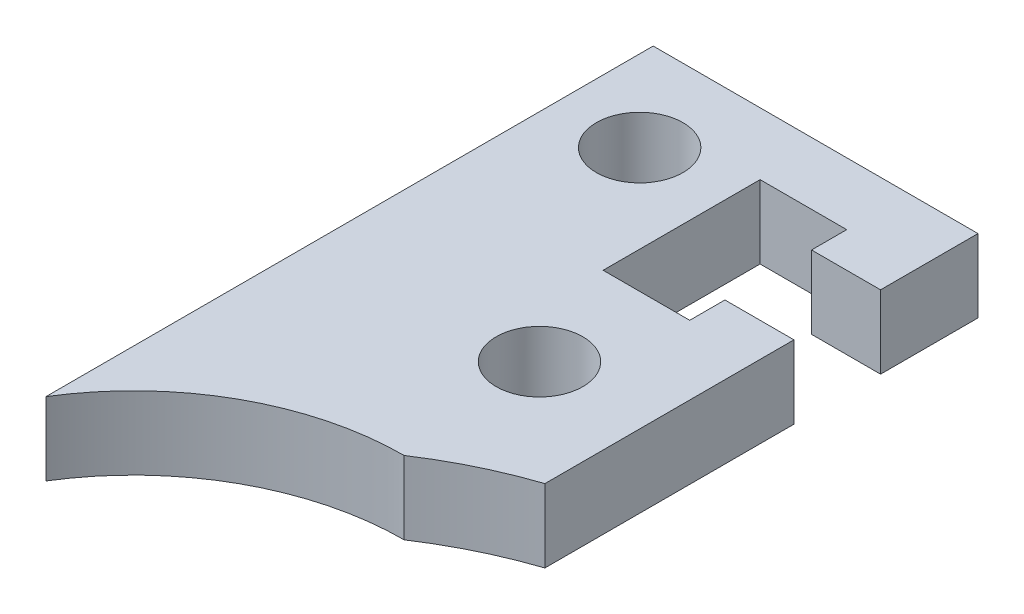
ISO-10303-21;
HEADER;
FILE_DESCRIPTION(('STEP AP214'),'2;1');
FILE_NAME('part.step','',(''),(''),'','','');
FILE_SCHEMA(('AUTOMOTIVE_DESIGN { 1 0 10303 214 1 1 1 1 }'));
ENDSEC;
DATA;
#1=APPLICATION_CONTEXT('core data for automotive mechanical design processes');
#2=APPLICATION_PROTOCOL_DEFINITION('international standard','automotive_design',2000,#1);
#3=PRODUCT_CONTEXT('',#1,'mechanical');
#4=PRODUCT('Part','Part','',(#3));
#5=PRODUCT_RELATED_PRODUCT_CATEGORY('part','',(#4));
#6=PRODUCT_DEFINITION_FORMATION('','',#4);
#7=PRODUCT_DEFINITION_CONTEXT('part definition',#1,'design');
#8=PRODUCT_DEFINITION('design','',#6,#7);
#9=PRODUCT_DEFINITION_SHAPE('','',#8);
#10=(LENGTH_UNIT() NAMED_UNIT(*) SI_UNIT(.MILLI.,.METRE.));
#11=(NAMED_UNIT(*) PLANE_ANGLE_UNIT() SI_UNIT($,.RADIAN.));
#12=(NAMED_UNIT(*) SI_UNIT($,.STERADIAN.) SOLID_ANGLE_UNIT());
#13=UNCERTAINTY_MEASURE_WITH_UNIT(LENGTH_MEASURE(1.E-05),#10,'distance_accuracy_value','');
#14=(GEOMETRIC_REPRESENTATION_CONTEXT(3) GLOBAL_UNCERTAINTY_ASSIGNED_CONTEXT((#13)) GLOBAL_UNIT_ASSIGNED_CONTEXT((#10,
#11,#12)) REPRESENTATION_CONTEXT('',''));
#15=CARTESIAN_POINT('',(0.,0.,0.));
#16=DIRECTION('',(0.,0.,1.));
#17=DIRECTION('',(1.,0.,0.));
#18=AXIS2_PLACEMENT_3D('',#15,#16,#17);
#19=CARTESIAN_POINT('',(0.,-1.35,0.));
#20=DIRECTION('',(0.,1.,0.));
#21=DIRECTION('',(1.,0.,0.));
#22=AXIS2_PLACEMENT_3D('',#19,#20,#21);
#23=PLANE('',#22);
#24=DIRECTION('',(0.,0.,1.));
#25=VECTOR('',#24,1.);
#26=CARTESIAN_POINT('',(19.5,-1.35,-20.9));
#27=LINE('',#26,#25);
#28=CARTESIAN_POINT('',(19.5,-1.35,-20.9));
#29=VERTEX_POINT('',#28);
#30=CARTESIAN_POINT('',(19.5,-1.35,-11.7));
#31=VERTEX_POINT('',#30);
#32=EDGE_CURVE('E11',#29,#31,#27,.T.);
#33=ORIENTED_EDGE('',*,*,#32,.T.);
#34=CARTESIAN_POINT('',(24.24820293215,-1.35,2.528653095606));
#35=DIRECTION('',(0.,1.,0.));
#36=DIRECTION('',(-0.31654686214341,0.,-0.94857687304043));
#37=AXIS2_PLACEMENT_3D('',#34,#35,#36);
#38=CIRCLE('',#37,15.);
#39=CARTESIAN_POINT('',(16.,-1.35,-10.));
#40=VERTEX_POINT('',#39);
#41=EDGE_CURVE('E27',#31,#40,#38,.T.);
#42=ORIENTED_EDGE('',*,*,#41,.T.);
#43=CARTESIAN_POINT('',(16.,-1.35,0.));
#44=DIRECTION('',(0.,1.,0.));
#45=DIRECTION('',(0.,0.,-1.));
#46=AXIS2_PLACEMENT_3D('',#43,#44,#45);
#47=CIRCLE('',#46,10.);
#48=CARTESIAN_POINT('',(7.5,-1.35,-5.267826876426));
#49=VERTEX_POINT('',#48);
#50=EDGE_CURVE('E244',#40,#49,#47,.T.);
#51=ORIENTED_EDGE('',*,*,#50,.T.);
#52=DIRECTION('',(0.,0.,-1.));
#53=VECTOR('',#52,1.);
#54=CARTESIAN_POINT('',(7.5,-1.35,-5.267826876426));
#55=LINE('',#54,#53);
#56=CARTESIAN_POINT('',(7.5,-1.35,-27.7));
#57=VERTEX_POINT('',#56);
#58=EDGE_CURVE('E240',#49,#57,#55,.T.);
#59=ORIENTED_EDGE('',*,*,#58,.T.);
#60=DIRECTION('',(-1.,0.,0.));
#61=VECTOR('',#60,1.);
#62=CARTESIAN_POINT('',(19.5,-1.35,-27.7));
#63=LINE('',#62,#61);
#64=CARTESIAN_POINT('',(19.5,-1.35,-27.7));
#65=VERTEX_POINT('',#64);
#66=EDGE_CURVE('E155',#65,#57,#63,.T.);
#67=ORIENTED_EDGE('',*,*,#66,.F.);
#68=DIRECTION('',(0.,0.,1.));
#69=VECTOR('',#68,1.);
#70=CARTESIAN_POINT('',(19.5,-1.35,-27.7));
#71=LINE('',#70,#69);
#72=CARTESIAN_POINT('',(19.5,-1.35,-24.1));
#73=VERTEX_POINT('',#72);
#74=EDGE_CURVE('E237',#65,#73,#71,.T.);
#75=ORIENTED_EDGE('',*,*,#74,.T.);
#76=DIRECTION('',(-1.,0.,0.));
#77=VECTOR('',#76,1.);
#78=CARTESIAN_POINT('',(19.5,-1.35,-24.1));
#79=LINE('',#78,#77);
#80=CARTESIAN_POINT('',(16.95,-1.35,-24.1));
#81=VERTEX_POINT('',#80);
#82=EDGE_CURVE('E234',#73,#81,#79,.T.);
#83=ORIENTED_EDGE('',*,*,#82,.T.);
#84=DIRECTION('',(0.,0.,-1.));
#85=VECTOR('',#84,1.);
#86=CARTESIAN_POINT('',(16.95,-1.35,-24.1));
#87=LINE('',#86,#85);
#88=CARTESIAN_POINT('',(16.95,-1.35,-25.4));
#89=VERTEX_POINT('',#88);
#90=EDGE_CURVE('E231',#81,#89,#87,.T.);
#91=ORIENTED_EDGE('',*,*,#90,.T.);
#92=DIRECTION('',(-1.,0.,0.));
#93=VECTOR('',#92,1.);
#94=CARTESIAN_POINT('',(16.95,-1.35,-25.4));
#95=LINE('',#94,#93);
#96=CARTESIAN_POINT('',(13.75,-1.35,-25.4));
#97=VERTEX_POINT('',#96);
#98=EDGE_CURVE('E227',#89,#97,#95,.T.);
#99=ORIENTED_EDGE('',*,*,#98,.T.);
#100=DIRECTION('',(0.,0.,1.));
#101=VECTOR('',#100,1.);
#102=CARTESIAN_POINT('',(13.75,-1.35,-25.4));
#103=LINE('',#102,#101);
#104=CARTESIAN_POINT('',(13.75,-1.35,-19.6));
#105=VERTEX_POINT('',#104);
#106=EDGE_CURVE('E226',#97,#105,#103,.T.);
#107=ORIENTED_EDGE('',*,*,#106,.T.);
#108=DIRECTION('',(1.,0.,0.));
#109=VECTOR('',#108,1.);
#110=CARTESIAN_POINT('',(13.75,-1.35,-19.6));
#111=LINE('',#110,#109);
#112=CARTESIAN_POINT('',(16.95,-1.35,-19.6));
#113=VERTEX_POINT('',#112);
#114=EDGE_CURVE('E222',#105,#113,#111,.T.);
#115=ORIENTED_EDGE('',*,*,#114,.T.);
#116=DIRECTION('',(0.,0.,-1.));
#117=VECTOR('',#116,1.);
#118=CARTESIAN_POINT('',(16.95,-1.35,-19.6));
#119=LINE('',#118,#117);
#120=CARTESIAN_POINT('',(16.95,-1.35,-20.9));
#121=VERTEX_POINT('',#120);
#122=EDGE_CURVE('E208',#113,#121,#119,.T.);
#123=ORIENTED_EDGE('',*,*,#122,.T.);
#124=DIRECTION('',(-1.,0.,0.));
#125=VECTOR('',#124,1.);
#126=CARTESIAN_POINT('',(19.5,-1.35,-20.9));
#127=LINE('',#126,#125);
#128=EDGE_CURVE('E121',#29,#121,#127,.T.);
#129=ORIENTED_EDGE('',*,*,#128,.F.);
#130=EDGE_LOOP('',(#33,#42,#51,#59,#67,#75,#83,#91,#99,#107,#115,#123,#129));
#131=FACE_BOUND('',#130,.T.);
#132=CARTESIAN_POINT('',(15.5,-1.35,-15.5));
#133=DIRECTION('',(0.,-1.,0.));
#134=DIRECTION('',(-1.,0.,0.));
#135=AXIS2_PLACEMENT_3D('',#132,#133,#134);
#136=CIRCLE('',#135,1.6);
#137=CARTESIAN_POINT('',(13.9,-1.35,-15.5));
#138=VERTEX_POINT('',#137);
#139=EDGE_CURVE('E193',#138,#138,#136,.T.);
#140=ORIENTED_EDGE('',*,*,#139,.F.);
#141=EDGE_LOOP('',(#140));
#142=FACE_BOUND('',#141,.T.);
#143=CARTESIAN_POINT('',(10.5,-1.35,-24.2));
#144=DIRECTION('',(0.,-1.,0.));
#145=DIRECTION('',(-1.,0.,0.));
#146=AXIS2_PLACEMENT_3D('',#143,#144,#145);
#147=CIRCLE('',#146,1.6);
#148=CARTESIAN_POINT('',(8.9,-1.35,-24.2));
#149=VERTEX_POINT('',#148);
#150=EDGE_CURVE('E180',#149,#149,#147,.T.);
#151=ORIENTED_EDGE('',*,*,#150,.F.);
#152=EDGE_LOOP('',(#151));
#153=FACE_BOUND('',#152,.T.);
#154=ADVANCED_FACE('F17',(#131,#142,#153),#23,.F.);
#155=CARTESIAN_POINT('',(15.5,1.35,-15.5));
#156=DIRECTION('',(0.,-1.,0.));
#157=DIRECTION('',(1.,0.,0.));
#158=AXIS2_PLACEMENT_3D('',#155,#156,#157);
#159=CYLINDRICAL_SURFACE('',#158,1.6);
#160=ORIENTED_EDGE('',*,*,#139,.T.);
#161=EDGE_LOOP('',(#160));
#162=FACE_BOUND('',#161,.T.);
#163=CARTESIAN_POINT('',(15.5,1.35,-15.5));
#164=DIRECTION('',(0.,-1.,0.));
#165=DIRECTION('',(1.,0.,0.));
#166=AXIS2_PLACEMENT_3D('',#163,#164,#165);
#167=CIRCLE('',#166,1.6);
#168=CARTESIAN_POINT('',(17.1,1.35,-15.5));
#169=VERTEX_POINT('',#168);
#170=EDGE_CURVE('E131',#169,#169,#167,.T.);
#171=ORIENTED_EDGE('',*,*,#170,.F.);
#172=EDGE_LOOP('',(#171));
#173=FACE_BOUND('',#172,.T.);
#174=ADVANCED_FACE('F280',(#162,#173),#159,.F.);
#175=CARTESIAN_POINT('',(0.,1.35,0.));
#176=DIRECTION('',(0.,1.,0.));
#177=DIRECTION('',(1.,0.,0.));
#178=AXIS2_PLACEMENT_3D('',#175,#176,#177);
#179=PLANE('',#178);
#180=DIRECTION('',(0.,0.,-1.));
#181=VECTOR('',#180,1.);
#182=CARTESIAN_POINT('',(16.95,1.35,-19.6));
#183=LINE('',#182,#181);
#184=CARTESIAN_POINT('',(16.95,1.35,-19.6));
#185=VERTEX_POINT('',#184);
#186=CARTESIAN_POINT('',(16.95,1.35,-20.9));
#187=VERTEX_POINT('',#186);
#188=EDGE_CURVE('E185',#185,#187,#183,.T.);
#189=ORIENTED_EDGE('',*,*,#188,.F.);
#190=DIRECTION('',(1.,0.,0.));
#191=VECTOR('',#190,1.);
#192=CARTESIAN_POINT('',(13.75,1.35,-19.6));
#193=LINE('',#192,#191);
#194=CARTESIAN_POINT('',(13.75,1.35,-19.6));
#195=VERTEX_POINT('',#194);
#196=EDGE_CURVE('E162',#195,#185,#193,.T.);
#197=ORIENTED_EDGE('',*,*,#196,.F.);
#198=DIRECTION('',(0.,0.,1.));
#199=VECTOR('',#198,1.);
#200=CARTESIAN_POINT('',(13.75,1.35,-25.4));
#201=LINE('',#200,#199);
#202=CARTESIAN_POINT('',(13.75,1.35,-25.4));
#203=VERTEX_POINT('',#202);
#204=EDGE_CURVE('E166',#203,#195,#201,.T.);
#205=ORIENTED_EDGE('',*,*,#204,.F.);
#206=DIRECTION('',(-1.,0.,0.));
#207=VECTOR('',#206,1.);
#208=CARTESIAN_POINT('',(16.95,1.35,-25.4));
#209=LINE('',#208,#207);
#210=CARTESIAN_POINT('',(16.95,1.35,-25.4));
#211=VERTEX_POINT('',#210);
#212=EDGE_CURVE('E171',#211,#203,#209,.T.);
#213=ORIENTED_EDGE('',*,*,#212,.F.);
#214=DIRECTION('',(0.,0.,-1.));
#215=VECTOR('',#214,1.);
#216=CARTESIAN_POINT('',(16.95,1.35,-24.1));
#217=LINE('',#216,#215);
#218=CARTESIAN_POINT('',(16.95,1.35,-24.1));
#219=VERTEX_POINT('',#218);
#220=EDGE_CURVE('E168',#219,#211,#217,.T.);
#221=ORIENTED_EDGE('',*,*,#220,.F.);
#222=DIRECTION('',(-1.,0.,0.));
#223=VECTOR('',#222,1.);
#224=CARTESIAN_POINT('',(19.5,1.35,-24.1));
#225=LINE('',#224,#223);
#226=CARTESIAN_POINT('',(19.5,1.35,-24.1));
#227=VERTEX_POINT('',#226);
#228=EDGE_CURVE('E148',#227,#219,#225,.T.);
#229=ORIENTED_EDGE('',*,*,#228,.F.);
#230=DIRECTION('',(0.,0.,1.));
#231=VECTOR('',#230,1.);
#232=CARTESIAN_POINT('',(19.5,1.35,-27.7));
#233=LINE('',#232,#231);
#234=CARTESIAN_POINT('',(19.5,1.35,-27.7));
#235=VERTEX_POINT('',#234);
#236=EDGE_CURVE('E139',#235,#227,#233,.T.);
#237=ORIENTED_EDGE('',*,*,#236,.F.);
#238=DIRECTION('',(-1.,0.,0.));
#239=VECTOR('',#238,1.);
#240=CARTESIAN_POINT('',(19.5,1.35,-27.7));
#241=LINE('',#240,#239);
#242=CARTESIAN_POINT('',(7.5,1.35,-27.7));
#243=VERTEX_POINT('',#242);
#244=EDGE_CURVE('E190',#235,#243,#241,.T.);
#245=ORIENTED_EDGE('',*,*,#244,.T.);
#246=DIRECTION('',(0.,0.,1.));
#247=VECTOR('',#246,1.);
#248=CARTESIAN_POINT('',(7.5,1.35,-27.7));
#249=LINE('',#248,#247);
#250=CARTESIAN_POINT('',(7.5,1.35,-5.267826876426));
#251=VERTEX_POINT('',#250);
#252=EDGE_CURVE('E130',#243,#251,#249,.T.);
#253=ORIENTED_EDGE('',*,*,#252,.T.);
#254=CARTESIAN_POINT('',(16.,1.35,0.));
#255=DIRECTION('',(0.,1.,0.));
#256=DIRECTION('',(0.,0.,-1.));
#257=AXIS2_PLACEMENT_3D('',#254,#255,#256);
#258=CIRCLE('',#257,10.);
#259=CARTESIAN_POINT('',(16.,1.35,-10.));
#260=VERTEX_POINT('',#259);
#261=EDGE_CURVE('E151',#260,#251,#258,.T.);
#262=ORIENTED_EDGE('',*,*,#261,.F.);
#263=CARTESIAN_POINT('',(24.24820293215,1.35,2.528653095606));
#264=DIRECTION('',(0.,1.,0.));
#265=DIRECTION('',(-0.31654686214341,0.,-0.94857687304043));
#266=AXIS2_PLACEMENT_3D('',#263,#264,#265);
#267=CIRCLE('',#266,15.);
#268=CARTESIAN_POINT('',(19.5,1.35,-11.7));
#269=VERTEX_POINT('',#268);
#270=EDGE_CURVE('E108',#269,#260,#267,.T.);
#271=ORIENTED_EDGE('',*,*,#270,.F.);
#272=DIRECTION('',(0.,0.,1.));
#273=VECTOR('',#272,1.);
#274=CARTESIAN_POINT('',(19.5,1.35,-20.9));
#275=LINE('',#274,#273);
#276=CARTESIAN_POINT('',(19.5,1.35,-20.9));
#277=VERTEX_POINT('',#276);
#278=EDGE_CURVE('E111',#277,#269,#275,.T.);
#279=ORIENTED_EDGE('',*,*,#278,.F.);
#280=DIRECTION('',(-1.,0.,0.));
#281=VECTOR('',#280,1.);
#282=CARTESIAN_POINT('',(19.5,1.35,-20.9));
#283=LINE('',#282,#281);
#284=EDGE_CURVE('E116',#277,#187,#283,.T.);
#285=ORIENTED_EDGE('',*,*,#284,.T.);
#286=EDGE_LOOP('',(#189,#197,#205,#213,#221,#229,#237,#245,#253,#262,#271,#279,#285));
#287=FACE_BOUND('',#286,.T.);
#288=ORIENTED_EDGE('',*,*,#170,.T.);
#289=EDGE_LOOP('',(#288));
#290=FACE_BOUND('',#289,.T.);
#291=CARTESIAN_POINT('',(10.5,1.35,-24.2));
#292=DIRECTION('',(0.,-1.,0.));
#293=DIRECTION('',(-1.,0.,0.));
#294=AXIS2_PLACEMENT_3D('',#291,#292,#293);
#295=CIRCLE('',#294,1.6);
#296=CARTESIAN_POINT('',(8.9,1.35,-24.2));
#297=VERTEX_POINT('',#296);
#298=EDGE_CURVE('E197',#297,#297,#295,.T.);
#299=ORIENTED_EDGE('',*,*,#298,.T.);
#300=EDGE_LOOP('',(#299));
#301=FACE_BOUND('',#300,.T.);
#302=ADVANCED_FACE('F114',(#287,#290,#301),#179,.T.);
#303=CARTESIAN_POINT('',(16.95,1.35,-20.9));
#304=DIRECTION('',(0.,0.,1.));
#305=DIRECTION('',(1.,0.,0.));
#306=AXIS2_PLACEMENT_3D('',#303,#304,#305);
#307=PLANE('',#306);
#308=DIRECTION('',(0.,1.,0.));
#309=VECTOR('',#308,1.);
#310=CARTESIAN_POINT('',(16.95,-1.35,-20.9));
#311=LINE('',#310,#309);
#312=EDGE_CURVE('E129',#121,#187,#311,.T.);
#313=ORIENTED_EDGE('',*,*,#312,.T.);
#314=ORIENTED_EDGE('',*,*,#284,.F.);
#315=DIRECTION('',(0.,1.,0.));
#316=VECTOR('',#315,1.);
#317=CARTESIAN_POINT('',(19.5,-1.35,-20.9));
#318=LINE('',#317,#316);
#319=EDGE_CURVE('E127',#29,#277,#318,.T.);
#320=ORIENTED_EDGE('',*,*,#319,.F.);
#321=ORIENTED_EDGE('',*,*,#128,.T.);
#322=EDGE_LOOP('',(#313,#314,#320,#321));
#323=FACE_BOUND('',#322,.T.);
#324=ADVANCED_FACE('F126',(#323),#307,.F.);
#325=CARTESIAN_POINT('',(19.5,1.35,-27.7));
#326=DIRECTION('',(-1.,0.,0.));
#327=DIRECTION('',(0.,0.,1.));
#328=AXIS2_PLACEMENT_3D('',#325,#326,#327);
#329=PLANE('',#328);
#330=ORIENTED_EDGE('',*,*,#278,.T.);
#331=DIRECTION('',(0.,-1.,0.));
#332=VECTOR('',#331,1.);
#333=CARTESIAN_POINT('',(19.5,1.35,-11.7));
#334=LINE('',#333,#332);
#335=EDGE_CURVE('E122',#269,#31,#334,.T.);
#336=ORIENTED_EDGE('',*,*,#335,.T.);
#337=ORIENTED_EDGE('',*,*,#32,.F.);
#338=ORIENTED_EDGE('',*,*,#319,.T.);
#339=EDGE_LOOP('',(#330,#336,#337,#338));
#340=FACE_BOUND('',#339,.T.);
#341=ADVANCED_FACE('F134',(#340),#329,.F.);
#342=CARTESIAN_POINT('',(19.5,1.35,-27.7));
#343=DIRECTION('',(-1.,0.,0.));
#344=DIRECTION('',(0.,0.,1.));
#345=AXIS2_PLACEMENT_3D('',#342,#343,#344);
#346=PLANE('',#345);
#347=ORIENTED_EDGE('',*,*,#74,.F.);
#348=DIRECTION('',(0.,1.,0.));
#349=VECTOR('',#348,1.);
#350=CARTESIAN_POINT('',(19.5,-1.35,-27.7));
#351=LINE('',#350,#349);
#352=EDGE_CURVE('E135',#65,#235,#351,.T.);
#353=ORIENTED_EDGE('',*,*,#352,.T.);
#354=ORIENTED_EDGE('',*,*,#236,.T.);
#355=DIRECTION('',(0.,1.,0.));
#356=VECTOR('',#355,1.);
#357=CARTESIAN_POINT('',(19.5,-1.35,-24.1));
#358=LINE('',#357,#356);
#359=EDGE_CURVE('E144',#73,#227,#358,.T.);
#360=ORIENTED_EDGE('',*,*,#359,.F.);
#361=EDGE_LOOP('',(#347,#353,#354,#360));
#362=FACE_BOUND('',#361,.T.);
#363=ADVANCED_FACE('F260',(#362),#346,.F.);
#364=CARTESIAN_POINT('',(24.24820293215,1.35,2.528653095606));
#365=DIRECTION('',(0.,1.,0.));
#366=DIRECTION('',(1.,0.,0.));
#367=AXIS2_PLACEMENT_3D('',#364,#365,#366);
#368=CYLINDRICAL_SURFACE('',#367,15.);
#369=ORIENTED_EDGE('',*,*,#335,.F.);
#370=ORIENTED_EDGE('',*,*,#270,.T.);
#371=DIRECTION('',(0.,-1.,0.));
#372=VECTOR('',#371,1.);
#373=CARTESIAN_POINT('',(16.,1.35,-10.));
#374=LINE('',#373,#372);
#375=EDGE_CURVE('E149',#260,#40,#374,.T.);
#376=ORIENTED_EDGE('',*,*,#375,.T.);
#377=ORIENTED_EDGE('',*,*,#41,.F.);
#378=EDGE_LOOP('',(#369,#370,#376,#377));
#379=FACE_BOUND('',#378,.T.);
#380=ADVANCED_FACE('F249',(#379),#368,.F.);
#381=CARTESIAN_POINT('',(16.,1.35,0.));
#382=DIRECTION('',(0.,1.,0.));
#383=DIRECTION('',(1.,0.,0.));
#384=AXIS2_PLACEMENT_3D('',#381,#382,#383);
#385=CYLINDRICAL_SURFACE('',#384,10.);
#386=ORIENTED_EDGE('',*,*,#50,.F.);
#387=ORIENTED_EDGE('',*,*,#375,.F.);
#388=ORIENTED_EDGE('',*,*,#261,.T.);
#389=DIRECTION('',(0.,1.,0.));
#390=VECTOR('',#389,1.);
#391=CARTESIAN_POINT('',(7.5,-1.35,-5.267826876426));
#392=LINE('',#391,#390);
#393=EDGE_CURVE('E152',#49,#251,#392,.T.);
#394=ORIENTED_EDGE('',*,*,#393,.F.);
#395=EDGE_LOOP('',(#386,#387,#388,#394));
#396=FACE_BOUND('',#395,.T.);
#397=ADVANCED_FACE('F251',(#396),#385,.F.);
#398=CARTESIAN_POINT('',(7.5,-1.35,-27.7));
#399=DIRECTION('',(-1.,0.,0.));
#400=DIRECTION('',(0.,0.,1.));
#401=AXIS2_PLACEMENT_3D('',#398,#399,#400);
#402=PLANE('',#401);
#403=DIRECTION('',(0.,1.,0.));
#404=VECTOR('',#403,1.);
#405=CARTESIAN_POINT('',(7.5,-1.35,-27.7));
#406=LINE('',#405,#404);
#407=EDGE_CURVE('E147',#57,#243,#406,.T.);
#408=ORIENTED_EDGE('',*,*,#407,.F.);
#409=ORIENTED_EDGE('',*,*,#58,.F.);
#410=ORIENTED_EDGE('',*,*,#393,.T.);
#411=ORIENTED_EDGE('',*,*,#252,.F.);
#412=EDGE_LOOP('',(#408,#409,#410,#411));
#413=FACE_BOUND('',#412,.T.);
#414=ADVANCED_FACE('F254',(#413),#402,.T.);
#415=CARTESIAN_POINT('',(29.1,-1.35,-27.7));
#416=DIRECTION('',(0.,0.,-1.));
#417=DIRECTION('',(-1.,0.,0.));
#418=AXIS2_PLACEMENT_3D('',#415,#416,#417);
#419=PLANE('',#418);
#420=ORIENTED_EDGE('',*,*,#66,.T.);
#421=ORIENTED_EDGE('',*,*,#407,.T.);
#422=ORIENTED_EDGE('',*,*,#244,.F.);
#423=ORIENTED_EDGE('',*,*,#352,.F.);
#424=EDGE_LOOP('',(#420,#421,#422,#423));
#425=FACE_BOUND('',#424,.T.);
#426=ADVANCED_FACE('F262',(#425),#419,.T.);
#427=CARTESIAN_POINT('',(19.5,1.35,-24.1));
#428=DIRECTION('',(0.,0.,-1.));
#429=DIRECTION('',(-1.,0.,0.));
#430=AXIS2_PLACEMENT_3D('',#427,#428,#429);
#431=PLANE('',#430);
#432=ORIENTED_EDGE('',*,*,#359,.T.);
#433=ORIENTED_EDGE('',*,*,#228,.T.);
#434=DIRECTION('',(0.,1.,0.));
#435=VECTOR('',#434,1.);
#436=CARTESIAN_POINT('',(16.95,-1.35,-24.1));
#437=LINE('',#436,#435);
#438=EDGE_CURVE('E158',#81,#219,#437,.T.);
#439=ORIENTED_EDGE('',*,*,#438,.F.);
#440=ORIENTED_EDGE('',*,*,#82,.F.);
#441=EDGE_LOOP('',(#432,#433,#439,#440));
#442=FACE_BOUND('',#441,.T.);
#443=ADVANCED_FACE('F264',(#442),#431,.F.);
#444=CARTESIAN_POINT('',(16.95,1.35,-19.6));
#445=DIRECTION('',(1.,0.,0.));
#446=DIRECTION('',(0.,0.,-1.));
#447=AXIS2_PLACEMENT_3D('',#444,#445,#446);
#448=PLANE('',#447);
#449=ORIENTED_EDGE('',*,*,#122,.F.);
#450=DIRECTION('',(0.,-1.,0.));
#451=VECTOR('',#450,1.);
#452=CARTESIAN_POINT('',(16.95,1.35,-19.6));
#453=LINE('',#452,#451);
#454=EDGE_CURVE('E163',#185,#113,#453,.T.);
#455=ORIENTED_EDGE('',*,*,#454,.F.);
#456=ORIENTED_EDGE('',*,*,#188,.T.);
#457=ORIENTED_EDGE('',*,*,#312,.F.);
#458=EDGE_LOOP('',(#449,#455,#456,#457));
#459=FACE_BOUND('',#458,.T.);
#460=ADVANCED_FACE('F219',(#459),#448,.F.);
#461=CARTESIAN_POINT('',(16.95,1.35,-19.6));
#462=DIRECTION('',(1.,0.,0.));
#463=DIRECTION('',(0.,0.,-1.));
#464=AXIS2_PLACEMENT_3D('',#461,#462,#463);
#465=PLANE('',#464);
#466=ORIENTED_EDGE('',*,*,#220,.T.);
#467=DIRECTION('',(0.,-1.,0.));
#468=VECTOR('',#467,1.);
#469=CARTESIAN_POINT('',(16.95,1.35,-25.4));
#470=LINE('',#469,#468);
#471=EDGE_CURVE('E161',#211,#89,#470,.T.);
#472=ORIENTED_EDGE('',*,*,#471,.T.);
#473=ORIENTED_EDGE('',*,*,#90,.F.);
#474=ORIENTED_EDGE('',*,*,#438,.T.);
#475=EDGE_LOOP('',(#466,#472,#473,#474));
#476=FACE_BOUND('',#475,.T.);
#477=ADVANCED_FACE('F267',(#476),#465,.F.);
#478=CARTESIAN_POINT('',(13.75,1.35,-19.6));
#479=DIRECTION('',(0.,0.,1.));
#480=DIRECTION('',(1.,0.,0.));
#481=AXIS2_PLACEMENT_3D('',#478,#479,#480);
#482=PLANE('',#481);
#483=DIRECTION('',(0.,-1.,0.));
#484=VECTOR('',#483,1.);
#485=CARTESIAN_POINT('',(13.75,1.35,-19.6));
#486=LINE('',#485,#484);
#487=EDGE_CURVE('E169',#195,#105,#486,.T.);
#488=ORIENTED_EDGE('',*,*,#487,.F.);
#489=ORIENTED_EDGE('',*,*,#196,.T.);
#490=ORIENTED_EDGE('',*,*,#454,.T.);
#491=ORIENTED_EDGE('',*,*,#114,.F.);
#492=EDGE_LOOP('',(#488,#489,#490,#491));
#493=FACE_BOUND('',#492,.T.);
#494=ADVANCED_FACE('F216',(#493),#482,.F.);
#495=CARTESIAN_POINT('',(13.75,1.35,-25.4));
#496=DIRECTION('',(-1.,0.,0.));
#497=DIRECTION('',(0.,0.,1.));
#498=AXIS2_PLACEMENT_3D('',#495,#496,#497);
#499=PLANE('',#498);
#500=DIRECTION('',(0.,-1.,0.));
#501=VECTOR('',#500,1.);
#502=CARTESIAN_POINT('',(13.75,1.35,-25.4));
#503=LINE('',#502,#501);
#504=EDGE_CURVE('E21',#203,#97,#503,.T.);
#505=ORIENTED_EDGE('',*,*,#504,.F.);
#506=ORIENTED_EDGE('',*,*,#204,.T.);
#507=ORIENTED_EDGE('',*,*,#487,.T.);
#508=ORIENTED_EDGE('',*,*,#106,.F.);
#509=EDGE_LOOP('',(#505,#506,#507,#508));
#510=FACE_BOUND('',#509,.T.);
#511=ADVANCED_FACE('F270',(#510),#499,.F.);
#512=CARTESIAN_POINT('',(16.95,1.35,-25.4));
#513=DIRECTION('',(0.,0.,-1.));
#514=DIRECTION('',(-1.,0.,0.));
#515=AXIS2_PLACEMENT_3D('',#512,#513,#514);
#516=PLANE('',#515);
#517=ORIENTED_EDGE('',*,*,#471,.F.);
#518=ORIENTED_EDGE('',*,*,#212,.T.);
#519=ORIENTED_EDGE('',*,*,#504,.T.);
#520=ORIENTED_EDGE('',*,*,#98,.F.);
#521=EDGE_LOOP('',(#517,#518,#519,#520));
#522=FACE_BOUND('',#521,.T.);
#523=ADVANCED_FACE('F268',(#522),#516,.F.);
#524=CARTESIAN_POINT('',(10.5,1.35,-24.2));
#525=DIRECTION('',(0.,-1.,0.));
#526=DIRECTION('',(1.,0.,0.));
#527=AXIS2_PLACEMENT_3D('',#524,#525,#526);
#528=CYLINDRICAL_SURFACE('',#527,1.6);
#529=ORIENTED_EDGE('',*,*,#150,.T.);
#530=EDGE_LOOP('',(#529));
#531=FACE_BOUND('',#530,.T.);
#532=ORIENTED_EDGE('',*,*,#298,.F.);
#533=EDGE_LOOP('',(#532));
#534=FACE_BOUND('',#533,.T.);
#535=ADVANCED_FACE('F19',(#531,#534),#528,.F.);
#536=CLOSED_SHELL('',(#154,#174,#302,#324,#341,#363,#380,#397,#414,#426,#443,#460,#477,#494,
#511,#523,#535));
#537=MANIFOLD_SOLID_BREP('B1',#536);
#538=ADVANCED_BREP_SHAPE_REPRESENTATION('',(#18,#537),#14);
#539=SHAPE_DEFINITION_REPRESENTATION(#9,#538);
ENDSEC;
END-ISO-10303-21;
